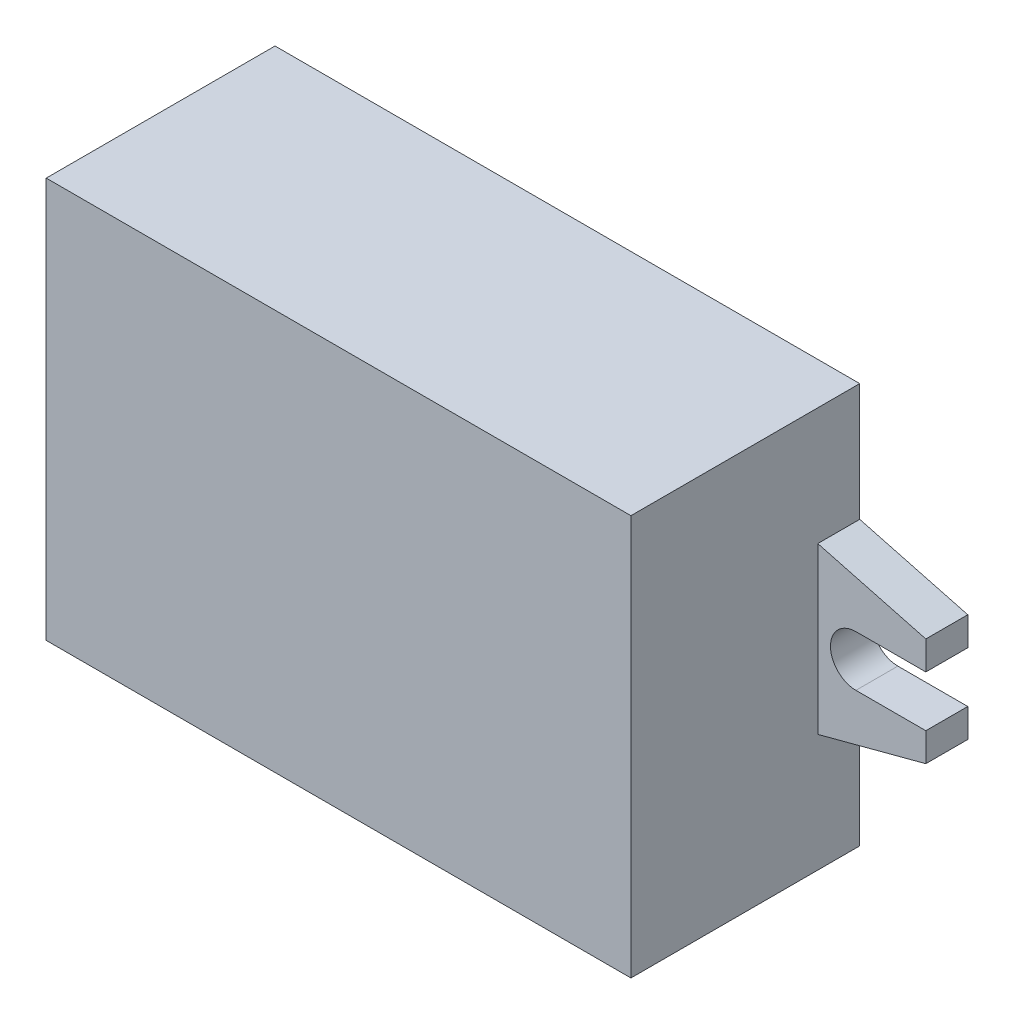
ISO-10303-21;
HEADER;
FILE_DESCRIPTION(('STEP AP214'),'2;1');
FILE_NAME('part.step','',(''),(''),'','','');
FILE_SCHEMA(('AUTOMOTIVE_DESIGN { 1 0 10303 214 1 1 1 1 }'));
ENDSEC;
DATA;
#1=APPLICATION_CONTEXT('core data for automotive mechanical design processes');
#2=APPLICATION_PROTOCOL_DEFINITION('international standard','automotive_design',2000,#1);
#3=PRODUCT_CONTEXT('',#1,'mechanical');
#4=PRODUCT('Part','Part','',(#3));
#5=PRODUCT_RELATED_PRODUCT_CATEGORY('part','',(#4));
#6=PRODUCT_DEFINITION_FORMATION('','',#4);
#7=PRODUCT_DEFINITION_CONTEXT('part definition',#1,'design');
#8=PRODUCT_DEFINITION('design','',#6,#7);
#9=PRODUCT_DEFINITION_SHAPE('','',#8);
#10=(LENGTH_UNIT() NAMED_UNIT(*) SI_UNIT(.MILLI.,.METRE.));
#11=(NAMED_UNIT(*) PLANE_ANGLE_UNIT() SI_UNIT($,.RADIAN.));
#12=(NAMED_UNIT(*) SI_UNIT($,.STERADIAN.) SOLID_ANGLE_UNIT());
#13=UNCERTAINTY_MEASURE_WITH_UNIT(LENGTH_MEASURE(1.E-05),#10,'distance_accuracy_value','');
#14=(GEOMETRIC_REPRESENTATION_CONTEXT(3) GLOBAL_UNCERTAINTY_ASSIGNED_CONTEXT((#13)) GLOBAL_UNIT_ASSIGNED_CONTEXT((#10,
#11,#12)) REPRESENTATION_CONTEXT('',''));
#15=CARTESIAN_POINT('',(0.,0.,0.));
#16=DIRECTION('',(0.,0.,1.));
#17=DIRECTION('',(1.,0.,0.));
#18=AXIS2_PLACEMENT_3D('',#15,#16,#17);
#19=CARTESIAN_POINT('',(54.5,0.,0.));
#20=DIRECTION('',(1.,0.,0.));
#21=DIRECTION('',(0.,0.,-1.));
#22=AXIS2_PLACEMENT_3D('',#19,#20,#21);
#23=PLANE('',#22);
#24=DIRECTION('',(0.,0.,1.));
#25=VECTOR('',#24,1.);
#26=CARTESIAN_POINT('',(54.5,17.75,0.));
#27=LINE('',#26,#25);
#28=CARTESIAN_POINT('',(54.5,17.75,0.));
#29=VERTEX_POINT('',#28);
#30=CARTESIAN_POINT('',(54.5,17.75,3.3));
#31=VERTEX_POINT('',#30);
#32=EDGE_CURVE('E11',#29,#31,#27,.T.);
#33=ORIENTED_EDGE('',*,*,#32,.F.);
#34=DIRECTION('',(0.,1.,0.));
#35=VECTOR('',#34,1.);
#36=CARTESIAN_POINT('',(54.5,9.25,0.));
#37=LINE('',#36,#35);
#38=CARTESIAN_POINT('',(54.5,20.,0.));
#39=VERTEX_POINT('',#38);
#40=EDGE_CURVE('E248',#29,#39,#37,.T.);
#41=ORIENTED_EDGE('',*,*,#40,.T.);
#42=DIRECTION('',(0.,0.,-1.));
#43=VECTOR('',#42,1.);
#44=CARTESIAN_POINT('',(54.5,20.,0.));
#45=LINE('',#44,#43);
#46=CARTESIAN_POINT('',(54.5,20.,3.3));
#47=VERTEX_POINT('',#46);
#48=EDGE_CURVE('E279',#47,#39,#45,.T.);
#49=ORIENTED_EDGE('',*,*,#48,.F.);
#50=DIRECTION('',(0.,-1.,0.));
#51=VECTOR('',#50,1.);
#52=CARTESIAN_POINT('',(54.5,9.25,3.3));
#53=LINE('',#52,#51);
#54=EDGE_CURVE('E249',#47,#31,#53,.T.);
#55=ORIENTED_EDGE('',*,*,#54,.T.);
#56=EDGE_LOOP('',(#33,#41,#49,#55));
#57=FACE_BOUND('',#56,.T.);
#58=ADVANCED_FACE('F37',(#57),#23,.T.);
#59=CARTESIAN_POINT('',(-8.5,0.,0.));
#60=DIRECTION('',(1.,0.,0.));
#61=DIRECTION('',(0.,0.,-1.));
#62=AXIS2_PLACEMENT_3D('',#59,#60,#61);
#63=PLANE('',#62);
#64=DIRECTION('',(0.,1.,0.));
#65=VECTOR('',#64,1.);
#66=CARTESIAN_POINT('',(-8.5,9.25,3.3));
#67=LINE('',#66,#65);
#68=CARTESIAN_POINT('',(-8.5,11.5,3.3));
#69=VERTEX_POINT('',#68);
#70=CARTESIAN_POINT('',(-8.5,13.75,3.3));
#71=VERTEX_POINT('',#70);
#72=EDGE_CURVE('E350',#69,#71,#67,.T.);
#73=ORIENTED_EDGE('',*,*,#72,.T.);
#74=DIRECTION('',(0.,0.,-1.));
#75=VECTOR('',#74,1.);
#76=CARTESIAN_POINT('',(-8.5,13.75,0.));
#77=LINE('',#76,#75);
#78=CARTESIAN_POINT('',(-8.5,13.75,0.));
#79=VERTEX_POINT('',#78);
#80=EDGE_CURVE('E276',#71,#79,#77,.T.);
#81=ORIENTED_EDGE('',*,*,#80,.T.);
#82=DIRECTION('',(0.,-1.,0.));
#83=VECTOR('',#82,1.);
#84=CARTESIAN_POINT('',(-8.5,9.25,0.));
#85=LINE('',#84,#83);
#86=CARTESIAN_POINT('',(-8.5,11.5,0.));
#87=VERTEX_POINT('',#86);
#88=EDGE_CURVE('E359',#79,#87,#85,.T.);
#89=ORIENTED_EDGE('',*,*,#88,.T.);
#90=DIRECTION('',(0.,0.,1.));
#91=VECTOR('',#90,1.);
#92=CARTESIAN_POINT('',(-8.5,11.5,0.));
#93=LINE('',#92,#91);
#94=EDGE_CURVE('E269',#87,#69,#93,.T.);
#95=ORIENTED_EDGE('',*,*,#94,.T.);
#96=EDGE_LOOP('',(#73,#81,#89,#95));
#97=FACE_BOUND('',#96,.T.);
#98=ADVANCED_FACE('F394',(#97),#63,.F.);
#99=CARTESIAN_POINT('',(46.,0.,18.));
#100=DIRECTION('',(-1.,0.,0.));
#101=DIRECTION('',(0.,0.,1.));
#102=AXIS2_PLACEMENT_3D('',#99,#100,#101);
#103=PLANE('',#102);
#104=DIRECTION('',(0.,0.,-1.));
#105=VECTOR('',#104,1.);
#106=CARTESIAN_POINT('',(46.,9.25,0.));
#107=LINE('',#106,#105);
#108=CARTESIAN_POINT('',(46.,9.25,3.3));
#109=VERTEX_POINT('',#108);
#110=CARTESIAN_POINT('',(46.,9.25,0.));
#111=VERTEX_POINT('',#110);
#112=EDGE_CURVE('E256',#109,#111,#107,.T.);
#113=ORIENTED_EDGE('',*,*,#112,.F.);
#114=DIRECTION('',(0.,-1.,0.));
#115=VECTOR('',#114,1.);
#116=CARTESIAN_POINT('',(46.,9.25,3.3));
#117=LINE('',#116,#115);
#118=CARTESIAN_POINT('',(46.,22.25,3.3));
#119=VERTEX_POINT('',#118);
#120=EDGE_CURVE('E253',#119,#109,#117,.T.);
#121=ORIENTED_EDGE('',*,*,#120,.F.);
#122=DIRECTION('',(0.,0.,1.));
#123=VECTOR('',#122,1.);
#124=CARTESIAN_POINT('',(46.,22.25,0.));
#125=LINE('',#124,#123);
#126=CARTESIAN_POINT('',(46.,22.25,0.));
#127=VERTEX_POINT('',#126);
#128=EDGE_CURVE('E242',#127,#119,#125,.T.);
#129=ORIENTED_EDGE('',*,*,#128,.F.);
#130=DIRECTION('',(0.,1.,0.));
#131=VECTOR('',#130,1.);
#132=CARTESIAN_POINT('',(46.,0.,0.));
#133=LINE('',#132,#131);
#134=CARTESIAN_POINT('',(46.,31.5,0.));
#135=VERTEX_POINT('',#134);
#136=EDGE_CURVE('E307',#127,#135,#133,.T.);
#137=ORIENTED_EDGE('',*,*,#136,.T.);
#138=DIRECTION('',(0.,0.,-1.));
#139=VECTOR('',#138,1.);
#140=CARTESIAN_POINT('',(46.,31.5,18.));
#141=LINE('',#140,#139);
#142=CARTESIAN_POINT('',(46.,31.5,18.));
#143=VERTEX_POINT('',#142);
#144=EDGE_CURVE('E325',#143,#135,#141,.T.);
#145=ORIENTED_EDGE('',*,*,#144,.F.);
#146=DIRECTION('',(0.,1.,0.));
#147=VECTOR('',#146,1.);
#148=CARTESIAN_POINT('',(46.,0.,18.));
#149=LINE('',#148,#147);
#150=CARTESIAN_POINT('',(46.,0.,18.));
#151=VERTEX_POINT('',#150);
#152=EDGE_CURVE('E341',#151,#143,#149,.T.);
#153=ORIENTED_EDGE('',*,*,#152,.F.);
#154=DIRECTION('',(0.,0.,-1.));
#155=VECTOR('',#154,1.);
#156=CARTESIAN_POINT('',(46.,0.,18.));
#157=LINE('',#156,#155);
#158=CARTESIAN_POINT('',(46.,0.,0.));
#159=VERTEX_POINT('',#158);
#160=EDGE_CURVE('E329',#151,#159,#157,.T.);
#161=ORIENTED_EDGE('',*,*,#160,.T.);
#162=EDGE_CURVE('E301',#159,#111,#133,.T.);
#163=ORIENTED_EDGE('',*,*,#162,.T.);
#164=EDGE_LOOP('',(#113,#121,#129,#137,#145,#153,#161,#163));
#165=FACE_BOUND('',#164,.T.);
#166=ADVANCED_FACE('F296',(#165),#103,.F.);
#167=CARTESIAN_POINT('',(0.,0.,18.));
#168=DIRECTION('',(1.,0.,0.));
#169=DIRECTION('',(0.,0.,-1.));
#170=AXIS2_PLACEMENT_3D('',#167,#168,#169);
#171=PLANE('',#170);
#172=DIRECTION('',(0.,0.,-1.));
#173=VECTOR('',#172,1.);
#174=CARTESIAN_POINT('',(0.,22.25,0.));
#175=LINE('',#174,#173);
#176=CARTESIAN_POINT('',(0.,22.25,3.3));
#177=VERTEX_POINT('',#176);
#178=CARTESIAN_POINT('',(0.,22.25,-2.25000000000684E-05));
#179=VERTEX_POINT('',#178);
#180=EDGE_CURVE('E314',#177,#179,#175,.T.);
#181=ORIENTED_EDGE('',*,*,#180,.F.);
#182=DIRECTION('',(0.,1.,0.));
#183=VECTOR('',#182,1.);
#184=CARTESIAN_POINT('',(0.,9.25,3.3));
#185=LINE('',#184,#183);
#186=CARTESIAN_POINT('',(0.,9.25,3.3));
#187=VERTEX_POINT('',#186);
#188=EDGE_CURVE('E348',#187,#177,#185,.T.);
#189=ORIENTED_EDGE('',*,*,#188,.F.);
#190=DIRECTION('',(0.,0.,1.));
#191=VECTOR('',#190,1.);
#192=CARTESIAN_POINT('',(0.,9.25,0.));
#193=LINE('',#192,#191);
#194=CARTESIAN_POINT('',(0.,9.25,-2.25000000000684E-05));
#195=VERTEX_POINT('',#194);
#196=EDGE_CURVE('E252',#195,#187,#193,.T.);
#197=ORIENTED_EDGE('',*,*,#196,.F.);
#198=DIRECTION('',(0.,-1.,0.));
#199=VECTOR('',#198,1.);
#200=CARTESIAN_POINT('',(0.,0.,0.));
#201=LINE('',#200,#199);
#202=CARTESIAN_POINT('',(0.,0.,0.));
#203=VERTEX_POINT('',#202);
#204=EDGE_CURVE('E335',#195,#203,#201,.T.);
#205=ORIENTED_EDGE('',*,*,#204,.T.);
#206=DIRECTION('',(0.,0.,-1.));
#207=VECTOR('',#206,1.);
#208=CARTESIAN_POINT('',(0.,0.,18.));
#209=LINE('',#208,#207);
#210=CARTESIAN_POINT('',(0.,0.,18.));
#211=VERTEX_POINT('',#210);
#212=EDGE_CURVE('E270',#211,#203,#209,.T.);
#213=ORIENTED_EDGE('',*,*,#212,.F.);
#214=DIRECTION('',(0.,-1.,0.));
#215=VECTOR('',#214,1.);
#216=CARTESIAN_POINT('',(0.,0.,18.));
#217=LINE('',#216,#215);
#218=CARTESIAN_POINT('',(0.,31.5,18.));
#219=VERTEX_POINT('',#218);
#220=EDGE_CURVE('E309',#219,#211,#217,.T.);
#221=ORIENTED_EDGE('',*,*,#220,.F.);
#222=DIRECTION('',(0.,0.,-1.));
#223=VECTOR('',#222,1.);
#224=CARTESIAN_POINT('',(0.,31.5,18.));
#225=LINE('',#224,#223);
#226=CARTESIAN_POINT('',(0.,31.5,0.));
#227=VERTEX_POINT('',#226);
#228=EDGE_CURVE('E322',#219,#227,#225,.T.);
#229=ORIENTED_EDGE('',*,*,#228,.T.);
#230=EDGE_CURVE('E332',#227,#179,#201,.T.);
#231=ORIENTED_EDGE('',*,*,#230,.T.);
#232=EDGE_LOOP('',(#181,#189,#197,#205,#213,#221,#229,#231));
#233=FACE_BOUND('',#232,.T.);
#234=ADVANCED_FACE('F39',(#233),#171,.F.);
#235=CARTESIAN_POINT('',(0.,0.,18.));
#236=DIRECTION('',(0.,1.,0.));
#237=DIRECTION('',(0.,0.,1.));
#238=AXIS2_PLACEMENT_3D('',#235,#236,#237);
#239=PLANE('',#238);
#240=DIRECTION('',(1.,0.,0.));
#241=VECTOR('',#240,1.);
#242=CARTESIAN_POINT('',(0.,0.,0.));
#243=LINE('',#242,#241);
#244=EDGE_CURVE('E304',#203,#159,#243,.T.);
#245=ORIENTED_EDGE('',*,*,#244,.T.);
#246=ORIENTED_EDGE('',*,*,#160,.F.);
#247=DIRECTION('',(1.,0.,0.));
#248=VECTOR('',#247,1.);
#249=CARTESIAN_POINT('',(0.,0.,18.));
#250=LINE('',#249,#248);
#251=EDGE_CURVE('E343',#211,#151,#250,.T.);
#252=ORIENTED_EDGE('',*,*,#251,.F.);
#253=ORIENTED_EDGE('',*,*,#212,.T.);
#254=EDGE_LOOP('',(#245,#246,#252,#253));
#255=FACE_BOUND('',#254,.T.);
#256=ADVANCED_FACE('F387',(#255),#239,.F.);
#257=CARTESIAN_POINT('',(0.,31.5,18.));
#258=DIRECTION('',(0.,-1.,0.));
#259=DIRECTION('',(0.,0.,-1.));
#260=AXIS2_PLACEMENT_3D('',#257,#258,#259);
#261=PLANE('',#260);
#262=DIRECTION('',(-1.,0.,0.));
#263=VECTOR('',#262,1.);
#264=CARTESIAN_POINT('',(0.,31.5,0.));
#265=LINE('',#264,#263);
#266=EDGE_CURVE('E306',#135,#227,#265,.T.);
#267=ORIENTED_EDGE('',*,*,#266,.T.);
#268=ORIENTED_EDGE('',*,*,#228,.F.);
#269=DIRECTION('',(-1.,0.,0.));
#270=VECTOR('',#269,1.);
#271=CARTESIAN_POINT('',(0.,31.5,18.));
#272=LINE('',#271,#270);
#273=EDGE_CURVE('E326',#143,#219,#272,.T.);
#274=ORIENTED_EDGE('',*,*,#273,.F.);
#275=ORIENTED_EDGE('',*,*,#144,.T.);
#276=EDGE_LOOP('',(#267,#268,#274,#275));
#277=FACE_BOUND('',#276,.T.);
#278=ADVANCED_FACE('F378',(#277),#261,.F.);
#279=CARTESIAN_POINT('',(0.,0.,18.));
#280=DIRECTION('',(0.,0.,-1.));
#281=DIRECTION('',(-1.,0.,0.));
#282=AXIS2_PLACEMENT_3D('',#279,#280,#281);
#283=PLANE('',#282);
#284=ORIENTED_EDGE('',*,*,#220,.T.);
#285=ORIENTED_EDGE('',*,*,#251,.T.);
#286=ORIENTED_EDGE('',*,*,#152,.T.);
#287=ORIENTED_EDGE('',*,*,#273,.T.);
#288=EDGE_LOOP('',(#284,#285,#286,#287));
#289=FACE_BOUND('',#288,.T.);
#290=ADVANCED_FACE('F385',(#289),#283,.F.);
#291=CARTESIAN_POINT('',(0.,0.,0.));
#292=DIRECTION('',(0.,0.,-1.));
#293=DIRECTION('',(-1.,0.,0.));
#294=AXIS2_PLACEMENT_3D('',#291,#292,#293);
#295=PLANE('',#294);
#296=DIRECTION('',(1.,0.,0.));
#297=VECTOR('',#296,1.);
#298=CARTESIAN_POINT('',(0.,17.75,0.));
#299=LINE('',#298,#297);
#300=CARTESIAN_POINT('',(49.,17.75,0.));
#301=VERTEX_POINT('',#300);
#302=EDGE_CURVE('E199',#301,#29,#299,.T.);
#303=ORIENTED_EDGE('',*,*,#302,.F.);
#304=CARTESIAN_POINT('',(49.,15.75,0.));
#305=DIRECTION('',(0.,0.,-1.));
#306=DIRECTION('',(-1.,0.,0.));
#307=AXIS2_PLACEMENT_3D('',#304,#305,#306);
#308=CIRCLE('',#307,2.);
#309=CARTESIAN_POINT('',(49.,13.75,0.));
#310=VERTEX_POINT('',#309);
#311=EDGE_CURVE('E201',#310,#301,#308,.T.);
#312=ORIENTED_EDGE('',*,*,#311,.F.);
#313=DIRECTION('',(-1.,0.,0.));
#314=VECTOR('',#313,1.);
#315=CARTESIAN_POINT('',(0.,13.75,0.));
#316=LINE('',#315,#314);
#317=CARTESIAN_POINT('',(54.5,13.75,0.));
#318=VERTEX_POINT('',#317);
#319=EDGE_CURVE('E176',#318,#310,#316,.T.);
#320=ORIENTED_EDGE('',*,*,#319,.F.);
#321=CARTESIAN_POINT('',(54.5,11.5,0.));
#322=VERTEX_POINT('',#321);
#323=EDGE_CURVE('E245',#322,#318,#37,.T.);
#324=ORIENTED_EDGE('',*,*,#323,.F.);
#325=DIRECTION('',(0.966705227861512,0.255892560316283,0.));
#326=VECTOR('',#325,1.);
#327=CARTESIAN_POINT('',(0.723928860145514,-2.73484236054972,0.));
#328=LINE('',#327,#326);
#329=EDGE_CURVE('E60',#111,#322,#328,.T.);
#330=ORIENTED_EDGE('',*,*,#329,.F.);
#331=ORIENTED_EDGE('',*,*,#162,.F.);
#332=ORIENTED_EDGE('',*,*,#244,.F.);
#333=ORIENTED_EDGE('',*,*,#204,.F.);
#334=DIRECTION('',(0.966705227861512,-0.255892560316283,0.));
#335=VECTOR('',#334,1.);
#336=CARTESIAN_POINT('',(2.28819725141471,8.64430072756669,0.));
#337=LINE('',#336,#335);
#338=EDGE_CURVE('E234',#87,#195,#337,.T.);
#339=ORIENTED_EDGE('',*,*,#338,.F.);
#340=ORIENTED_EDGE('',*,*,#88,.F.);
#341=DIRECTION('',(-1.,0.,0.));
#342=VECTOR('',#341,1.);
#343=CARTESIAN_POINT('',(0.,13.75,0.));
#344=LINE('',#343,#342);
#345=CARTESIAN_POINT('',(-3.,13.75,0.));
#346=VERTEX_POINT('',#345);
#347=EDGE_CURVE('E228',#346,#79,#344,.T.);
#348=ORIENTED_EDGE('',*,*,#347,.F.);
#349=CARTESIAN_POINT('',(-3.,15.75,0.));
#350=DIRECTION('',(0.,0.,-1.));
#351=DIRECTION('',(-1.,0.,0.));
#352=AXIS2_PLACEMENT_3D('',#349,#350,#351);
#353=CIRCLE('',#352,2.);
#354=CARTESIAN_POINT('',(-3.,17.75,0.));
#355=VERTEX_POINT('',#354);
#356=EDGE_CURVE('E230',#355,#346,#353,.T.);
#357=ORIENTED_EDGE('',*,*,#356,.F.);
#358=DIRECTION('',(1.,0.,0.));
#359=VECTOR('',#358,1.);
#360=CARTESIAN_POINT('',(0.,17.75,0.));
#361=LINE('',#360,#359);
#362=CARTESIAN_POINT('',(-8.5,17.75,0.));
#363=VERTEX_POINT('',#362);
#364=EDGE_CURVE('E225',#363,#355,#361,.T.);
#365=ORIENTED_EDGE('',*,*,#364,.F.);
#366=CARTESIAN_POINT('',(-8.5,20.,0.));
#367=VERTEX_POINT('',#366);
#368=EDGE_CURVE('E259',#367,#363,#85,.T.);
#369=ORIENTED_EDGE('',*,*,#368,.F.);
#370=DIRECTION('',(-0.966705227861512,-0.255892560316282,0.));
#371=VECTOR('',#370,1.);
#372=CARTESIAN_POINT('',(-5.50404203718674,20.7930476960388,0.));
#373=LINE('',#372,#371);
#374=EDGE_CURVE('E240',#179,#367,#373,.T.);
#375=ORIENTED_EDGE('',*,*,#374,.F.);
#376=ORIENTED_EDGE('',*,*,#230,.F.);
#377=ORIENTED_EDGE('',*,*,#266,.F.);
#378=ORIENTED_EDGE('',*,*,#136,.F.);
#379=DIRECTION('',(-0.966705227861512,0.255892560316282,0.));
#380=VECTOR('',#379,1.);
#381=CARTESIAN_POINT('',(8.51616814874696,32.1721907841552,0.));
#382=LINE('',#381,#380);
#383=EDGE_CURVE('E210',#39,#127,#382,.T.);
#384=ORIENTED_EDGE('',*,*,#383,.F.);
#385=ORIENTED_EDGE('',*,*,#40,.F.);
#386=EDGE_LOOP('',(#303,#312,#320,#324,#330,#331,#332,#333,#339,#340,#348,#357,#365,#369,#375,
#376,#377,#378,#384,#385));
#387=FACE_BOUND('',#386,.T.);
#388=ADVANCED_FACE('F287',(#387),#295,.T.);
#389=CARTESIAN_POINT('',(-8.5,9.25,3.3));
#390=DIRECTION('',(0.,0.,-1.));
#391=DIRECTION('',(-1.,0.,0.));
#392=AXIS2_PLACEMENT_3D('',#389,#390,#391);
#393=PLANE('',#392);
#394=CARTESIAN_POINT('',(-3.,15.75,3.3));
#395=DIRECTION('',(0.,0.,1.));
#396=DIRECTION('',(1.,0.,0.));
#397=AXIS2_PLACEMENT_3D('',#394,#395,#396);
#398=CIRCLE('',#397,2.);
#399=CARTESIAN_POINT('',(-3.,13.75,3.3));
#400=VERTEX_POINT('',#399);
#401=CARTESIAN_POINT('',(-3.,17.75,3.3));
#402=VERTEX_POINT('',#401);
#403=EDGE_CURVE('E212',#400,#402,#398,.T.);
#404=ORIENTED_EDGE('',*,*,#403,.F.);
#405=DIRECTION('',(1.,0.,0.));
#406=VECTOR('',#405,1.);
#407=CARTESIAN_POINT('',(-3.,13.75,3.3));
#408=LINE('',#407,#406);
#409=EDGE_CURVE('E219',#71,#400,#408,.T.);
#410=ORIENTED_EDGE('',*,*,#409,.F.);
#411=ORIENTED_EDGE('',*,*,#72,.F.);
#412=DIRECTION('',(-0.966705227861512,0.255892560316283,0.));
#413=VECTOR('',#412,1.);
#414=CARTESIAN_POINT('',(-8.5,11.5,3.3));
#415=LINE('',#414,#413);
#416=EDGE_CURVE('E232',#187,#69,#415,.T.);
#417=ORIENTED_EDGE('',*,*,#416,.F.);
#418=ORIENTED_EDGE('',*,*,#188,.T.);
#419=DIRECTION('',(0.966705227861512,0.255892560316282,0.));
#420=VECTOR('',#419,1.);
#421=CARTESIAN_POINT('',(-8.5,20.,3.3));
#422=LINE('',#421,#420);
#423=CARTESIAN_POINT('',(-8.5,20.,3.3));
#424=VERTEX_POINT('',#423);
#425=EDGE_CURVE('E236',#424,#177,#422,.T.);
#426=ORIENTED_EDGE('',*,*,#425,.F.);
#427=CARTESIAN_POINT('',(-8.5,17.75,3.3));
#428=VERTEX_POINT('',#427);
#429=EDGE_CURVE('E352',#428,#424,#67,.T.);
#430=ORIENTED_EDGE('',*,*,#429,.F.);
#431=DIRECTION('',(-1.,0.,0.));
#432=VECTOR('',#431,1.);
#433=CARTESIAN_POINT('',(-3.,17.75,3.3));
#434=LINE('',#433,#432);
#435=EDGE_CURVE('E217',#402,#428,#434,.T.);
#436=ORIENTED_EDGE('',*,*,#435,.F.);
#437=EDGE_LOOP('',(#404,#410,#411,#417,#418,#426,#430,#436));
#438=FACE_BOUND('',#437,.T.);
#439=ADVANCED_FACE('F398',(#438),#393,.F.);
#440=ORIENTED_EDGE('',*,*,#368,.T.);
#441=DIRECTION('',(0.,0.,1.));
#442=VECTOR('',#441,1.);
#443=CARTESIAN_POINT('',(-8.5,17.75,0.));
#444=LINE('',#443,#442);
#445=EDGE_CURVE('E273',#363,#428,#444,.T.);
#446=ORIENTED_EDGE('',*,*,#445,.T.);
#447=ORIENTED_EDGE('',*,*,#429,.T.);
#448=DIRECTION('',(0.,0.,-1.));
#449=VECTOR('',#448,1.);
#450=CARTESIAN_POINT('',(-8.5,20.,0.));
#451=LINE('',#450,#449);
#452=EDGE_CURVE('E266',#424,#367,#451,.T.);
#453=ORIENTED_EDGE('',*,*,#452,.T.);
#454=EDGE_LOOP('',(#440,#446,#447,#453));
#455=FACE_BOUND('',#454,.T.);
#456=ADVANCED_FACE('F409',(#455),#63,.F.);
#457=CARTESIAN_POINT('',(54.5,9.25,3.3));
#458=DIRECTION('',(0.,0.,-1.));
#459=DIRECTION('',(-1.,0.,0.));
#460=AXIS2_PLACEMENT_3D('',#457,#458,#459);
#461=PLANE('',#460);
#462=CARTESIAN_POINT('',(49.,15.75,3.3));
#463=DIRECTION('',(0.,0.,1.));
#464=DIRECTION('',(1.,0.,0.));
#465=AXIS2_PLACEMENT_3D('',#462,#463,#464);
#466=CIRCLE('',#465,2.);
#467=CARTESIAN_POINT('',(49.,17.75,3.3));
#468=VERTEX_POINT('',#467);
#469=CARTESIAN_POINT('',(49.,13.75,3.3));
#470=VERTEX_POINT('',#469);
#471=EDGE_CURVE('E183',#468,#470,#466,.T.);
#472=ORIENTED_EDGE('',*,*,#471,.F.);
#473=DIRECTION('',(-1.,0.,0.));
#474=VECTOR('',#473,1.);
#475=CARTESIAN_POINT('',(49.,17.75,3.3));
#476=LINE('',#475,#474);
#477=EDGE_CURVE('E180',#31,#468,#476,.T.);
#478=ORIENTED_EDGE('',*,*,#477,.F.);
#479=ORIENTED_EDGE('',*,*,#54,.F.);
#480=DIRECTION('',(0.966705227861512,-0.255892560316282,0.));
#481=VECTOR('',#480,1.);
#482=CARTESIAN_POINT('',(46.,22.25,3.3));
#483=LINE('',#482,#481);
#484=EDGE_CURVE('E206',#119,#47,#483,.T.);
#485=ORIENTED_EDGE('',*,*,#484,.F.);
#486=ORIENTED_EDGE('',*,*,#120,.T.);
#487=DIRECTION('',(-0.966705227861512,-0.255892560316283,0.));
#488=VECTOR('',#487,1.);
#489=CARTESIAN_POINT('',(54.5,11.5,3.3));
#490=LINE('',#489,#488);
#491=CARTESIAN_POINT('',(54.5,11.5,3.3));
#492=VERTEX_POINT('',#491);
#493=EDGE_CURVE('E203',#492,#109,#490,.T.);
#494=ORIENTED_EDGE('',*,*,#493,.F.);
#495=CARTESIAN_POINT('',(54.5,13.75,3.3));
#496=VERTEX_POINT('',#495);
#497=EDGE_CURVE('E193',#496,#492,#53,.T.);
#498=ORIENTED_EDGE('',*,*,#497,.F.);
#499=DIRECTION('',(1.,0.,0.));
#500=VECTOR('',#499,1.);
#501=CARTESIAN_POINT('',(54.5,13.75,3.3));
#502=LINE('',#501,#500);
#503=EDGE_CURVE('E52',#470,#496,#502,.T.);
#504=ORIENTED_EDGE('',*,*,#503,.F.);
#505=EDGE_LOOP('',(#472,#478,#479,#485,#486,#494,#498,#504));
#506=FACE_BOUND('',#505,.T.);
#507=ADVANCED_FACE('F191',(#506),#461,.F.);
#508=DIRECTION('',(0.,0.,-1.));
#509=VECTOR('',#508,1.);
#510=CARTESIAN_POINT('',(54.5,13.75,0.));
#511=LINE('',#510,#509);
#512=EDGE_CURVE('E45',#496,#318,#511,.T.);
#513=ORIENTED_EDGE('',*,*,#512,.F.);
#514=ORIENTED_EDGE('',*,*,#497,.T.);
#515=DIRECTION('',(0.,0.,1.));
#516=VECTOR('',#515,1.);
#517=CARTESIAN_POINT('',(54.5,11.5,0.));
#518=LINE('',#517,#516);
#519=EDGE_CURVE('E282',#322,#492,#518,.T.);
#520=ORIENTED_EDGE('',*,*,#519,.F.);
#521=ORIENTED_EDGE('',*,*,#323,.T.);
#522=EDGE_LOOP('',(#513,#514,#520,#521));
#523=FACE_BOUND('',#522,.T.);
#524=ADVANCED_FACE('F288',(#523),#23,.T.);
#525=CARTESIAN_POINT('',(-8.5,20.,-5.00000000001367E-05));
#526=DIRECTION('',(0.255892560316282,-0.966705227861512,0.));
#527=DIRECTION('',(0.966705227861512,0.255892560316282,0.));
#528=AXIS2_PLACEMENT_3D('',#525,#526,#527);
#529=PLANE('',#528);
#530=ORIENTED_EDGE('',*,*,#374,.T.);
#531=ORIENTED_EDGE('',*,*,#452,.F.);
#532=ORIENTED_EDGE('',*,*,#425,.T.);
#533=ORIENTED_EDGE('',*,*,#180,.T.);
#534=EDGE_LOOP('',(#530,#531,#532,#533));
#535=FACE_BOUND('',#534,.T.);
#536=ADVANCED_FACE('F366',(#535),#529,.F.);
#537=CARTESIAN_POINT('',(-8.5,11.5,-5.00000000001367E-05));
#538=DIRECTION('',(0.255892560316283,0.966705227861512,0.));
#539=DIRECTION('',(-0.966705227861512,0.255892560316283,0.));
#540=AXIS2_PLACEMENT_3D('',#537,#538,#539);
#541=PLANE('',#540);
#542=ORIENTED_EDGE('',*,*,#338,.T.);
#543=ORIENTED_EDGE('',*,*,#196,.T.);
#544=ORIENTED_EDGE('',*,*,#416,.T.);
#545=ORIENTED_EDGE('',*,*,#94,.F.);
#546=EDGE_LOOP('',(#542,#543,#544,#545));
#547=FACE_BOUND('',#546,.T.);
#548=ADVANCED_FACE('F392',(#547),#541,.F.);
#549=CARTESIAN_POINT('',(-3.,15.75,-5.00000000001367E-05));
#550=DIRECTION('',(0.,0.,1.));
#551=DIRECTION('',(1.,0.,0.));
#552=AXIS2_PLACEMENT_3D('',#549,#550,#551);
#553=CYLINDRICAL_SURFACE('',#552,2.);
#554=ORIENTED_EDGE('',*,*,#356,.T.);
#555=DIRECTION('',(0.,0.,1.));
#556=VECTOR('',#555,1.);
#557=CARTESIAN_POINT('',(-3.,13.75,-5.00000000001367E-05));
#558=LINE('',#557,#556);
#559=EDGE_CURVE('E223',#346,#400,#558,.T.);
#560=ORIENTED_EDGE('',*,*,#559,.T.);
#561=ORIENTED_EDGE('',*,*,#403,.T.);
#562=DIRECTION('',(0.,0.,1.));
#563=VECTOR('',#562,1.);
#564=CARTESIAN_POINT('',(-3.,17.75,-5.00000000001367E-05));
#565=LINE('',#564,#563);
#566=EDGE_CURVE('E222',#355,#402,#565,.T.);
#567=ORIENTED_EDGE('',*,*,#566,.F.);
#568=EDGE_LOOP('',(#554,#560,#561,#567));
#569=FACE_BOUND('',#568,.T.);
#570=ADVANCED_FACE('F406',(#569),#553,.F.);
#571=CARTESIAN_POINT('',(-3.,13.75,-5.00000000001367E-05));
#572=DIRECTION('',(0.,-1.,0.));
#573=DIRECTION('',(0.,0.,-1.));
#574=AXIS2_PLACEMENT_3D('',#571,#572,#573);
#575=PLANE('',#574);
#576=ORIENTED_EDGE('',*,*,#347,.T.);
#577=ORIENTED_EDGE('',*,*,#80,.F.);
#578=ORIENTED_EDGE('',*,*,#409,.T.);
#579=ORIENTED_EDGE('',*,*,#559,.F.);
#580=EDGE_LOOP('',(#576,#577,#578,#579));
#581=FACE_BOUND('',#580,.T.);
#582=ADVANCED_FACE('F402',(#581),#575,.F.);
#583=CARTESIAN_POINT('',(-3.,17.75,-5.00000000001367E-05));
#584=DIRECTION('',(0.,1.,0.));
#585=DIRECTION('',(0.,0.,1.));
#586=AXIS2_PLACEMENT_3D('',#583,#584,#585);
#587=PLANE('',#586);
#588=ORIENTED_EDGE('',*,*,#364,.T.);
#589=ORIENTED_EDGE('',*,*,#566,.T.);
#590=ORIENTED_EDGE('',*,*,#435,.T.);
#591=ORIENTED_EDGE('',*,*,#445,.F.);
#592=EDGE_LOOP('',(#588,#589,#590,#591));
#593=FACE_BOUND('',#592,.T.);
#594=ADVANCED_FACE('F408',(#593),#587,.F.);
#595=CARTESIAN_POINT('',(46.,22.25,-0.000185000000000202));
#596=DIRECTION('',(-0.255892560316282,-0.966705227861512,0.));
#597=DIRECTION('',(0.966705227861512,-0.255892560316282,0.));
#598=AXIS2_PLACEMENT_3D('',#595,#596,#597);
#599=PLANE('',#598);
#600=ORIENTED_EDGE('',*,*,#383,.T.);
#601=ORIENTED_EDGE('',*,*,#128,.T.);
#602=ORIENTED_EDGE('',*,*,#484,.T.);
#603=ORIENTED_EDGE('',*,*,#48,.T.);
#604=EDGE_LOOP('',(#600,#601,#602,#603));
#605=FACE_BOUND('',#604,.T.);
#606=ADVANCED_FACE('F439',(#605),#599,.F.);
#607=CARTESIAN_POINT('',(54.5,11.5,-0.000185000000000202));
#608=DIRECTION('',(-0.255892560316283,0.966705227861512,0.));
#609=DIRECTION('',(-0.966705227861512,-0.255892560316283,0.));
#610=AXIS2_PLACEMENT_3D('',#607,#608,#609);
#611=PLANE('',#610);
#612=ORIENTED_EDGE('',*,*,#329,.T.);
#613=ORIENTED_EDGE('',*,*,#519,.T.);
#614=ORIENTED_EDGE('',*,*,#493,.T.);
#615=ORIENTED_EDGE('',*,*,#112,.T.);
#616=EDGE_LOOP('',(#612,#613,#614,#615));
#617=FACE_BOUND('',#616,.T.);
#618=ADVANCED_FACE('F289',(#617),#611,.F.);
#619=CARTESIAN_POINT('',(49.,15.75,-0.000185000000000202));
#620=DIRECTION('',(0.,0.,1.));
#621=DIRECTION('',(1.,0.,0.));
#622=AXIS2_PLACEMENT_3D('',#619,#620,#621);
#623=CYLINDRICAL_SURFACE('',#622,2.);
#624=ORIENTED_EDGE('',*,*,#311,.T.);
#625=DIRECTION('',(0.,0.,1.));
#626=VECTOR('',#625,1.);
#627=CARTESIAN_POINT('',(49.,17.75,-0.000185000000000202));
#628=LINE('',#627,#626);
#629=EDGE_CURVE('E179',#301,#468,#628,.T.);
#630=ORIENTED_EDGE('',*,*,#629,.T.);
#631=ORIENTED_EDGE('',*,*,#471,.T.);
#632=DIRECTION('',(0.,0.,1.));
#633=VECTOR('',#632,1.);
#634=CARTESIAN_POINT('',(49.,13.75,-0.000185000000000202));
#635=LINE('',#634,#633);
#636=EDGE_CURVE('E172',#310,#470,#635,.T.);
#637=ORIENTED_EDGE('',*,*,#636,.F.);
#638=EDGE_LOOP('',(#624,#630,#631,#637));
#639=FACE_BOUND('',#638,.T.);
#640=ADVANCED_FACE('F184',(#639),#623,.F.);
#641=CARTESIAN_POINT('',(49.,17.75,-0.000185000000000202));
#642=DIRECTION('',(0.,1.,0.));
#643=DIRECTION('',(0.,0.,1.));
#644=AXIS2_PLACEMENT_3D('',#641,#642,#643);
#645=PLANE('',#644);
#646=ORIENTED_EDGE('',*,*,#302,.T.);
#647=ORIENTED_EDGE('',*,*,#32,.T.);
#648=ORIENTED_EDGE('',*,*,#477,.T.);
#649=ORIENTED_EDGE('',*,*,#629,.F.);
#650=EDGE_LOOP('',(#646,#647,#648,#649));
#651=FACE_BOUND('',#650,.T.);
#652=ADVANCED_FACE('F449',(#651),#645,.F.);
#653=CARTESIAN_POINT('',(54.5,13.75,-0.000185000000000202));
#654=DIRECTION('',(0.,-1.,0.));
#655=DIRECTION('',(1.,0.,0.));
#656=AXIS2_PLACEMENT_3D('',#653,#654,#655);
#657=PLANE('',#656);
#658=ORIENTED_EDGE('',*,*,#319,.T.);
#659=ORIENTED_EDGE('',*,*,#636,.T.);
#660=ORIENTED_EDGE('',*,*,#503,.T.);
#661=ORIENTED_EDGE('',*,*,#512,.T.);
#662=EDGE_LOOP('',(#658,#659,#660,#661));
#663=FACE_BOUND('',#662,.T.);
#664=ADVANCED_FACE('F174',(#663),#657,.F.);
#665=CLOSED_SHELL('',(#58,#98,#166,#234,#256,#278,#290,#388,#439,#456,#507,#524,#536,#548,#570,
#582,#594,#606,#618,#640,#652,#664));
#666=MANIFOLD_SOLID_BREP('B2',#665);
#667=ADVANCED_BREP_SHAPE_REPRESENTATION('',(#18,#666),#14);
#668=SHAPE_DEFINITION_REPRESENTATION(#9,#667);
ENDSEC;
END-ISO-10303-21;
